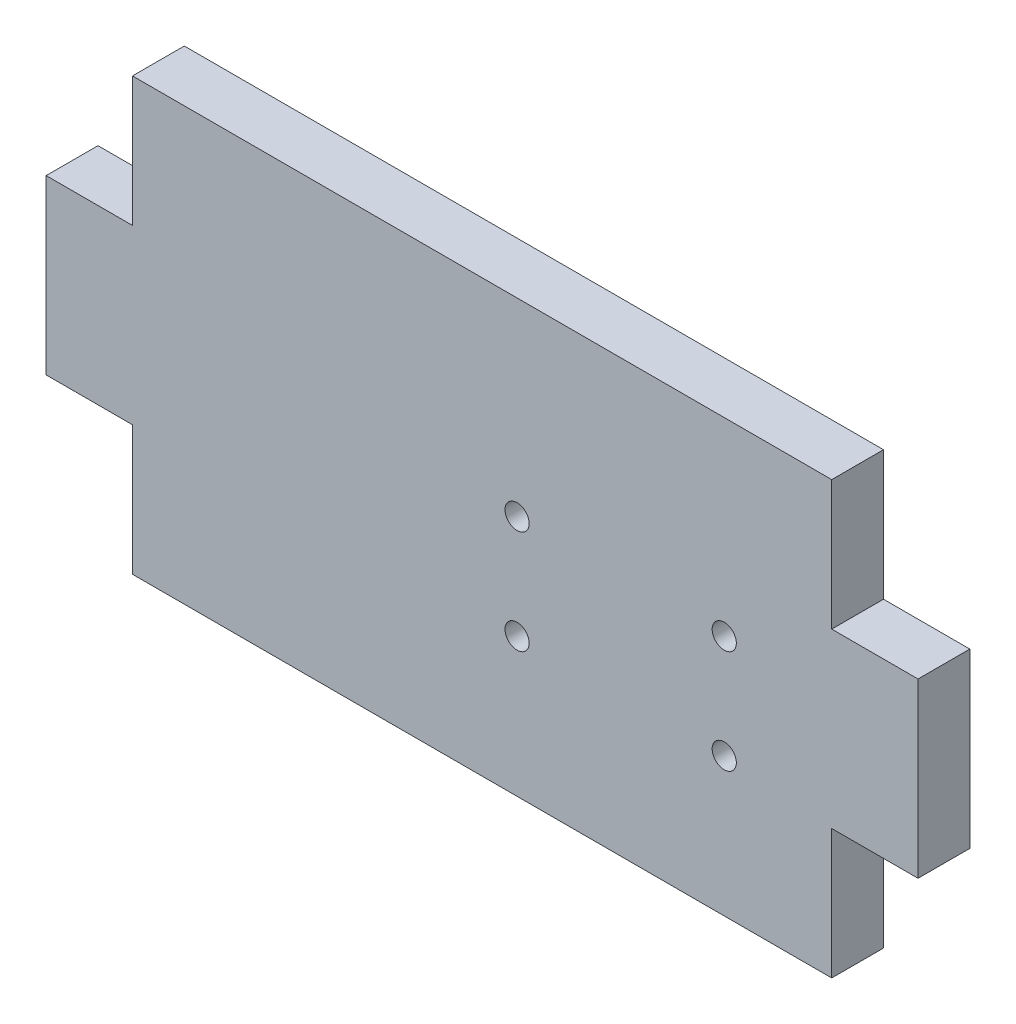
ISO-10303-21;
HEADER;
FILE_DESCRIPTION(('STEP AP214'),'2;1');
FILE_NAME('part.step','',(''),(''),'','','');
FILE_SCHEMA(('AUTOMOTIVE_DESIGN { 1 0 10303 214 1 1 1 1 }'));
ENDSEC;
DATA;
#1=APPLICATION_CONTEXT('core data for automotive mechanical design processes');
#2=APPLICATION_PROTOCOL_DEFINITION('international standard','automotive_design',2000,#1);
#3=PRODUCT_CONTEXT('',#1,'mechanical');
#4=PRODUCT('Part','Part','',(#3));
#5=PRODUCT_RELATED_PRODUCT_CATEGORY('part','',(#4));
#6=PRODUCT_DEFINITION_FORMATION('','',#4);
#7=PRODUCT_DEFINITION_CONTEXT('part definition',#1,'design');
#8=PRODUCT_DEFINITION('design','',#6,#7);
#9=PRODUCT_DEFINITION_SHAPE('','',#8);
#10=(LENGTH_UNIT() NAMED_UNIT(*) SI_UNIT(.MILLI.,.METRE.));
#11=(NAMED_UNIT(*) PLANE_ANGLE_UNIT() SI_UNIT($,.RADIAN.));
#12=(NAMED_UNIT(*) SI_UNIT($,.STERADIAN.) SOLID_ANGLE_UNIT());
#13=UNCERTAINTY_MEASURE_WITH_UNIT(LENGTH_MEASURE(1.E-05),#10,'distance_accuracy_value','');
#14=(GEOMETRIC_REPRESENTATION_CONTEXT(3) GLOBAL_UNCERTAINTY_ASSIGNED_CONTEXT((#13)) GLOBAL_UNIT_ASSIGNED_CONTEXT((#10,
#11,#12)) REPRESENTATION_CONTEXT('',''));
#15=CARTESIAN_POINT('',(0.,0.,0.));
#16=DIRECTION('',(0.,0.,1.));
#17=DIRECTION('',(1.,0.,0.));
#18=AXIS2_PLACEMENT_3D('',#15,#16,#17);
#19=CARTESIAN_POINT('',(44.550340057059,16.0653133446784,9.95979797464467));
#20=DIRECTION('',(0.,0.,-1.));
#21=DIRECTION('',(-1.,0.,0.));
#22=AXIS2_PLACEMENT_3D('',#19,#20,#21);
#23=CYLINDRICAL_SURFACE('',#22,1.4);
#24=CARTESIAN_POINT('',(44.550340057059,16.0653133446784,6.));
#25=DIRECTION('',(0.,0.,1.));
#26=DIRECTION('',(1.,0.,0.));
#27=AXIS2_PLACEMENT_3D('',#24,#25,#26);
#28=CIRCLE('',#27,1.4);
#29=CARTESIAN_POINT('',(45.950340057059,16.0653133446784,6.));
#30=VERTEX_POINT('',#29);
#31=EDGE_CURVE('E167',#30,#30,#28,.F.);
#32=ORIENTED_EDGE('',*,*,#31,.F.);
#33=EDGE_LOOP('',(#32));
#34=FACE_BOUND('',#33,.T.);
#35=CARTESIAN_POINT('',(44.550340057059,16.0653133446784,4.));
#36=DIRECTION('',(0.,0.,-1.));
#37=DIRECTION('',(-1.,0.,0.));
#38=AXIS2_PLACEMENT_3D('',#35,#36,#37);
#39=CIRCLE('',#38,1.4);
#40=CARTESIAN_POINT('',(43.150340057059,16.0653133446784,4.));
#41=VERTEX_POINT('',#40);
#42=EDGE_CURVE('E41',#41,#41,#39,.F.);
#43=ORIENTED_EDGE('',*,*,#42,.F.);
#44=EDGE_LOOP('',(#43));
#45=FACE_BOUND('',#44,.T.);
#46=ADVANCED_FACE('F37',(#34,#45),#23,.F.);
#47=CARTESIAN_POINT('',(44.550340057059,28.0653133446784,9.95979797464467));
#48=DIRECTION('',(0.,0.,-1.));
#49=DIRECTION('',(-1.,0.,0.));
#50=AXIS2_PLACEMENT_3D('',#47,#48,#49);
#51=CYLINDRICAL_SURFACE('',#50,1.4);
#52=CARTESIAN_POINT('',(44.550340057059,28.0653133446784,6.));
#53=DIRECTION('',(0.,0.,1.));
#54=DIRECTION('',(1.,0.,0.));
#55=AXIS2_PLACEMENT_3D('',#52,#53,#54);
#56=CIRCLE('',#55,1.4);
#57=CARTESIAN_POINT('',(45.950340057059,28.0653133446784,6.));
#58=VERTEX_POINT('',#57);
#59=EDGE_CURVE('E230',#58,#58,#56,.F.);
#60=ORIENTED_EDGE('',*,*,#59,.F.);
#61=EDGE_LOOP('',(#60));
#62=FACE_BOUND('',#61,.T.);
#63=CARTESIAN_POINT('',(44.550340057059,28.0653133446784,4.));
#64=DIRECTION('',(0.,0.,-1.));
#65=DIRECTION('',(-1.,0.,0.));
#66=AXIS2_PLACEMENT_3D('',#63,#64,#65);
#67=CIRCLE('',#66,1.4);
#68=CARTESIAN_POINT('',(43.150340057059,28.0653133446784,4.));
#69=VERTEX_POINT('',#68);
#70=EDGE_CURVE('E216',#69,#69,#67,.F.);
#71=ORIENTED_EDGE('',*,*,#70,.F.);
#72=EDGE_LOOP('',(#71));
#73=FACE_BOUND('',#72,.T.);
#74=ADVANCED_FACE('F272',(#62,#73),#51,.F.);
#75=CARTESIAN_POINT('',(68.550340057059,28.0653133446784,9.95979797464467));
#76=DIRECTION('',(0.,0.,-1.));
#77=DIRECTION('',(-1.,0.,0.));
#78=AXIS2_PLACEMENT_3D('',#75,#76,#77);
#79=CYLINDRICAL_SURFACE('',#78,1.4);
#80=CARTESIAN_POINT('',(68.550340057059,28.0653133446784,6.));
#81=DIRECTION('',(0.,0.,1.));
#82=DIRECTION('',(1.,0.,0.));
#83=AXIS2_PLACEMENT_3D('',#80,#81,#82);
#84=CIRCLE('',#83,1.4);
#85=CARTESIAN_POINT('',(69.950340057059,28.0653133446784,6.));
#86=VERTEX_POINT('',#85);
#87=EDGE_CURVE('E225',#86,#86,#84,.F.);
#88=ORIENTED_EDGE('',*,*,#87,.F.);
#89=EDGE_LOOP('',(#88));
#90=FACE_BOUND('',#89,.T.);
#91=CARTESIAN_POINT('',(68.550340057059,28.0653133446784,4.));
#92=DIRECTION('',(0.,0.,-1.));
#93=DIRECTION('',(-1.,0.,0.));
#94=AXIS2_PLACEMENT_3D('',#91,#92,#93);
#95=CIRCLE('',#94,1.4);
#96=CARTESIAN_POINT('',(67.150340057059,28.0653133446784,4.));
#97=VERTEX_POINT('',#96);
#98=EDGE_CURVE('E213',#97,#97,#95,.F.);
#99=ORIENTED_EDGE('',*,*,#98,.F.);
#100=EDGE_LOOP('',(#99));
#101=FACE_BOUND('',#100,.T.);
#102=ADVANCED_FACE('F278',(#90,#101),#79,.F.);
#103=CARTESIAN_POINT('',(68.550340057059,16.0653133446784,9.95979797464467));
#104=DIRECTION('',(0.,0.,-1.));
#105=DIRECTION('',(-1.,0.,0.));
#106=AXIS2_PLACEMENT_3D('',#103,#104,#105);
#107=CYLINDRICAL_SURFACE('',#106,1.4);
#108=CARTESIAN_POINT('',(68.550340057059,16.0653133446784,6.));
#109=DIRECTION('',(0.,0.,1.));
#110=DIRECTION('',(1.,0.,0.));
#111=AXIS2_PLACEMENT_3D('',#108,#109,#110);
#112=CIRCLE('',#111,1.4);
#113=CARTESIAN_POINT('',(69.950340057059,16.0653133446784,6.));
#114=VERTEX_POINT('',#113);
#115=EDGE_CURVE('E221',#114,#114,#112,.F.);
#116=ORIENTED_EDGE('',*,*,#115,.F.);
#117=EDGE_LOOP('',(#116));
#118=FACE_BOUND('',#117,.T.);
#119=CARTESIAN_POINT('',(68.550340057059,16.0653133446784,4.));
#120=DIRECTION('',(0.,0.,-1.));
#121=DIRECTION('',(-1.,0.,0.));
#122=AXIS2_PLACEMENT_3D('',#119,#120,#121);
#123=CIRCLE('',#122,1.4);
#124=CARTESIAN_POINT('',(67.150340057059,16.0653133446784,4.));
#125=VERTEX_POINT('',#124);
#126=EDGE_CURVE('E210',#125,#125,#123,.F.);
#127=ORIENTED_EDGE('',*,*,#126,.F.);
#128=EDGE_LOOP('',(#127));
#129=FACE_BOUND('',#128,.T.);
#130=ADVANCED_FACE('F284',(#118,#129),#107,.F.);
#131=CARTESIAN_POINT('',(0.,35.,6.));
#132=DIRECTION('',(0.,-1.,0.));
#133=DIRECTION('',(0.,0.,-1.));
#134=AXIS2_PLACEMENT_3D('',#131,#132,#133);
#135=PLANE('',#134);
#136=DIRECTION('',(-1.,0.,0.));
#137=VECTOR('',#136,1.);
#138=CARTESIAN_POINT('',(0.,35.,0.));
#139=LINE('',#138,#137);
#140=CARTESIAN_POINT('',(0.,35.,0.));
#141=VERTEX_POINT('',#140);
#142=CARTESIAN_POINT('',(-10.,35.,0.));
#143=VERTEX_POINT('',#142);
#144=EDGE_CURVE('E164',#141,#143,#139,.T.);
#145=ORIENTED_EDGE('',*,*,#144,.T.);
#146=DIRECTION('',(0.,0.,-1.));
#147=VECTOR('',#146,1.);
#148=CARTESIAN_POINT('',(-10.,35.,6.));
#149=LINE('',#148,#147);
#150=CARTESIAN_POINT('',(-10.,35.,6.));
#151=VERTEX_POINT('',#150);
#152=EDGE_CURVE('E11',#151,#143,#149,.T.);
#153=ORIENTED_EDGE('',*,*,#152,.F.);
#154=DIRECTION('',(-1.,0.,0.));
#155=VECTOR('',#154,1.);
#156=CARTESIAN_POINT('',(0.,35.,6.));
#157=LINE('',#156,#155);
#158=CARTESIAN_POINT('',(0.,35.,6.));
#159=VERTEX_POINT('',#158);
#160=EDGE_CURVE('E236',#159,#151,#157,.T.);
#161=ORIENTED_EDGE('',*,*,#160,.F.);
#162=DIRECTION('',(0.,0.,-1.));
#163=VECTOR('',#162,1.);
#164=CARTESIAN_POINT('',(0.,35.,6.));
#165=LINE('',#164,#163);
#166=EDGE_CURVE('E56',#159,#141,#165,.T.);
#167=ORIENTED_EDGE('',*,*,#166,.T.);
#168=EDGE_LOOP('',(#145,#153,#161,#167));
#169=FACE_BOUND('',#168,.T.);
#170=ADVANCED_FACE('F39',(#169),#135,.F.);
#171=CARTESIAN_POINT('',(-10.,0.,6.));
#172=DIRECTION('',(1.,0.,0.));
#173=DIRECTION('',(0.,1.,0.));
#174=AXIS2_PLACEMENT_3D('',#171,#172,#173);
#175=PLANE('',#174);
#176=DIRECTION('',(0.,-1.,0.));
#177=VECTOR('',#176,1.);
#178=CARTESIAN_POINT('',(-10.,0.,0.));
#179=LINE('',#178,#177);
#180=CARTESIAN_POINT('',(-10.,15.,0.));
#181=VERTEX_POINT('',#180);
#182=EDGE_CURVE('E166',#143,#181,#179,.T.);
#183=ORIENTED_EDGE('',*,*,#182,.T.);
#184=DIRECTION('',(0.,0.,-1.));
#185=VECTOR('',#184,1.);
#186=CARTESIAN_POINT('',(-10.,15.,6.));
#187=LINE('',#186,#185);
#188=CARTESIAN_POINT('',(-10.,15.,6.));
#189=VERTEX_POINT('',#188);
#190=EDGE_CURVE('E47',#189,#181,#187,.T.);
#191=ORIENTED_EDGE('',*,*,#190,.F.);
#192=DIRECTION('',(0.,-1.,0.));
#193=VECTOR('',#192,1.);
#194=CARTESIAN_POINT('',(-10.,0.,6.));
#195=LINE('',#194,#193);
#196=EDGE_CURVE('E106',#151,#189,#195,.T.);
#197=ORIENTED_EDGE('',*,*,#196,.F.);
#198=ORIENTED_EDGE('',*,*,#152,.T.);
#199=EDGE_LOOP('',(#183,#191,#197,#198));
#200=FACE_BOUND('',#199,.T.);
#201=ADVANCED_FACE('F376',(#200),#175,.F.);
#202=CARTESIAN_POINT('',(0.,15.,6.));
#203=DIRECTION('',(0.,-1.,0.));
#204=DIRECTION('',(0.,0.,-1.));
#205=AXIS2_PLACEMENT_3D('',#202,#203,#204);
#206=PLANE('',#205);
#207=DIRECTION('',(-1.,0.,0.));
#208=VECTOR('',#207,1.);
#209=CARTESIAN_POINT('',(0.,15.,0.));
#210=LINE('',#209,#208);
#211=CARTESIAN_POINT('',(0.,15.,0.));
#212=VERTEX_POINT('',#211);
#213=EDGE_CURVE('E170',#212,#181,#210,.T.);
#214=ORIENTED_EDGE('',*,*,#213,.F.);
#215=DIRECTION('',(0.,0.,-1.));
#216=VECTOR('',#215,1.);
#217=CARTESIAN_POINT('',(0.,15.,6.));
#218=LINE('',#217,#216);
#219=CARTESIAN_POINT('',(0.,15.,6.));
#220=VERTEX_POINT('',#219);
#221=EDGE_CURVE('E207',#220,#212,#218,.T.);
#222=ORIENTED_EDGE('',*,*,#221,.F.);
#223=DIRECTION('',(-1.,0.,0.));
#224=VECTOR('',#223,1.);
#225=CARTESIAN_POINT('',(0.,15.,6.));
#226=LINE('',#225,#224);
#227=EDGE_CURVE('E239',#220,#189,#226,.T.);
#228=ORIENTED_EDGE('',*,*,#227,.T.);
#229=ORIENTED_EDGE('',*,*,#190,.T.);
#230=EDGE_LOOP('',(#214,#222,#228,#229));
#231=FACE_BOUND('',#230,.T.);
#232=ADVANCED_FACE('F269',(#231),#206,.T.);
#233=CARTESIAN_POINT('',(0.,0.,6.));
#234=DIRECTION('',(-1.,0.,0.));
#235=DIRECTION('',(0.,0.,1.));
#236=AXIS2_PLACEMENT_3D('',#233,#234,#235);
#237=PLANE('',#236);
#238=DIRECTION('',(0.,1.,0.));
#239=VECTOR('',#238,1.);
#240=CARTESIAN_POINT('',(0.,0.,0.));
#241=LINE('',#240,#239);
#242=CARTESIAN_POINT('',(0.,0.,0.));
#243=VERTEX_POINT('',#242);
#244=EDGE_CURVE('E173',#243,#212,#241,.T.);
#245=ORIENTED_EDGE('',*,*,#244,.F.);
#246=DIRECTION('',(0.,0.,-1.));
#247=VECTOR('',#246,1.);
#248=CARTESIAN_POINT('',(0.,0.,6.));
#249=LINE('',#248,#247);
#250=CARTESIAN_POINT('',(0.,0.,6.));
#251=VERTEX_POINT('',#250);
#252=EDGE_CURVE('E205',#251,#243,#249,.T.);
#253=ORIENTED_EDGE('',*,*,#252,.F.);
#254=DIRECTION('',(0.,1.,0.));
#255=VECTOR('',#254,1.);
#256=CARTESIAN_POINT('',(0.,0.,6.));
#257=LINE('',#256,#255);
#258=EDGE_CURVE('E160',#251,#220,#257,.T.);
#259=ORIENTED_EDGE('',*,*,#258,.T.);
#260=ORIENTED_EDGE('',*,*,#221,.T.);
#261=EDGE_LOOP('',(#245,#253,#259,#260));
#262=FACE_BOUND('',#261,.T.);
#263=ADVANCED_FACE('F259',(#262),#237,.T.);
#264=CARTESIAN_POINT('',(0.,0.,6.));
#265=DIRECTION('',(0.,1.,0.));
#266=DIRECTION('',(0.,0.,1.));
#267=AXIS2_PLACEMENT_3D('',#264,#265,#266);
#268=PLANE('',#267);
#269=DIRECTION('',(1.,0.,0.));
#270=VECTOR('',#269,1.);
#271=CARTESIAN_POINT('',(0.,0.,0.));
#272=LINE('',#271,#270);
#273=CARTESIAN_POINT('',(81.,0.,0.));
#274=VERTEX_POINT('',#273);
#275=EDGE_CURVE('E176',#243,#274,#272,.T.);
#276=ORIENTED_EDGE('',*,*,#275,.T.);
#277=DIRECTION('',(0.,0.,-1.));
#278=VECTOR('',#277,1.);
#279=CARTESIAN_POINT('',(81.,0.,6.));
#280=LINE('',#279,#278);
#281=CARTESIAN_POINT('',(81.,0.,6.));
#282=VERTEX_POINT('',#281);
#283=EDGE_CURVE('E202',#282,#274,#280,.T.);
#284=ORIENTED_EDGE('',*,*,#283,.F.);
#285=DIRECTION('',(1.,0.,0.));
#286=VECTOR('',#285,1.);
#287=CARTESIAN_POINT('',(0.,0.,6.));
#288=LINE('',#287,#286);
#289=EDGE_CURVE('E243',#251,#282,#288,.T.);
#290=ORIENTED_EDGE('',*,*,#289,.F.);
#291=ORIENTED_EDGE('',*,*,#252,.T.);
#292=EDGE_LOOP('',(#276,#284,#290,#291));
#293=FACE_BOUND('',#292,.T.);
#294=ADVANCED_FACE('F268',(#293),#268,.F.);
#295=CARTESIAN_POINT('',(81.,0.,6.));
#296=DIRECTION('',(-1.,0.,0.));
#297=DIRECTION('',(0.,0.,1.));
#298=AXIS2_PLACEMENT_3D('',#295,#296,#297);
#299=PLANE('',#298);
#300=DIRECTION('',(0.,1.,0.));
#301=VECTOR('',#300,1.);
#302=CARTESIAN_POINT('',(81.,0.,0.));
#303=LINE('',#302,#301);
#304=CARTESIAN_POINT('',(81.,15.,0.));
#305=VERTEX_POINT('',#304);
#306=EDGE_CURVE('E179',#274,#305,#303,.T.);
#307=ORIENTED_EDGE('',*,*,#306,.T.);
#308=DIRECTION('',(0.,0.,-1.));
#309=VECTOR('',#308,1.);
#310=CARTESIAN_POINT('',(81.,15.,6.));
#311=LINE('',#310,#309);
#312=CARTESIAN_POINT('',(81.,15.,6.));
#313=VERTEX_POINT('',#312);
#314=EDGE_CURVE('E199',#313,#305,#311,.T.);
#315=ORIENTED_EDGE('',*,*,#314,.F.);
#316=DIRECTION('',(0.,1.,0.));
#317=VECTOR('',#316,1.);
#318=CARTESIAN_POINT('',(81.,0.,6.));
#319=LINE('',#318,#317);
#320=EDGE_CURVE('E146',#282,#313,#319,.T.);
#321=ORIENTED_EDGE('',*,*,#320,.F.);
#322=ORIENTED_EDGE('',*,*,#283,.T.);
#323=EDGE_LOOP('',(#307,#315,#321,#322));
#324=FACE_BOUND('',#323,.T.);
#325=ADVANCED_FACE('F398',(#324),#299,.F.);
#326=CARTESIAN_POINT('',(0.,15.,6.));
#327=DIRECTION('',(0.,1.,0.));
#328=DIRECTION('',(0.,0.,1.));
#329=AXIS2_PLACEMENT_3D('',#326,#327,#328);
#330=PLANE('',#329);
#331=DIRECTION('',(1.,0.,0.));
#332=VECTOR('',#331,1.);
#333=CARTESIAN_POINT('',(0.,15.,0.));
#334=LINE('',#333,#332);
#335=CARTESIAN_POINT('',(91.,15.,0.));
#336=VERTEX_POINT('',#335);
#337=EDGE_CURVE('E181',#305,#336,#334,.T.);
#338=ORIENTED_EDGE('',*,*,#337,.T.);
#339=DIRECTION('',(0.,0.,-1.));
#340=VECTOR('',#339,1.);
#341=CARTESIAN_POINT('',(91.,15.,6.));
#342=LINE('',#341,#340);
#343=CARTESIAN_POINT('',(91.,15.,6.));
#344=VERTEX_POINT('',#343);
#345=EDGE_CURVE('E197',#344,#336,#342,.T.);
#346=ORIENTED_EDGE('',*,*,#345,.F.);
#347=DIRECTION('',(1.,0.,0.));
#348=VECTOR('',#347,1.);
#349=CARTESIAN_POINT('',(0.,15.,6.));
#350=LINE('',#349,#348);
#351=EDGE_CURVE('E245',#313,#344,#350,.T.);
#352=ORIENTED_EDGE('',*,*,#351,.F.);
#353=ORIENTED_EDGE('',*,*,#314,.T.);
#354=EDGE_LOOP('',(#338,#346,#352,#353));
#355=FACE_BOUND('',#354,.T.);
#356=ADVANCED_FACE('F402',(#355),#330,.F.);
#357=CARTESIAN_POINT('',(91.,0.,6.));
#358=DIRECTION('',(1.,0.,0.));
#359=DIRECTION('',(0.,0.,-1.));
#360=AXIS2_PLACEMENT_3D('',#357,#358,#359);
#361=PLANE('',#360);
#362=DIRECTION('',(0.,-1.,0.));
#363=VECTOR('',#362,1.);
#364=CARTESIAN_POINT('',(91.,0.,0.));
#365=LINE('',#364,#363);
#366=CARTESIAN_POINT('',(91.,35.,0.));
#367=VERTEX_POINT('',#366);
#368=EDGE_CURVE('E184',#367,#336,#365,.T.);
#369=ORIENTED_EDGE('',*,*,#368,.F.);
#370=DIRECTION('',(0.,0.,-1.));
#371=VECTOR('',#370,1.);
#372=CARTESIAN_POINT('',(91.,35.,6.));
#373=LINE('',#372,#371);
#374=CARTESIAN_POINT('',(91.,35.,6.));
#375=VERTEX_POINT('',#374);
#376=EDGE_CURVE('E195',#375,#367,#373,.T.);
#377=ORIENTED_EDGE('',*,*,#376,.F.);
#378=DIRECTION('',(0.,-1.,0.));
#379=VECTOR('',#378,1.);
#380=CARTESIAN_POINT('',(91.,0.,6.));
#381=LINE('',#380,#379);
#382=EDGE_CURVE('E246',#375,#344,#381,.T.);
#383=ORIENTED_EDGE('',*,*,#382,.T.);
#384=ORIENTED_EDGE('',*,*,#345,.T.);
#385=EDGE_LOOP('',(#369,#377,#383,#384));
#386=FACE_BOUND('',#385,.T.);
#387=ADVANCED_FACE('F403',(#386),#361,.T.);
#388=CARTESIAN_POINT('',(0.,35.,6.));
#389=DIRECTION('',(0.,1.,0.));
#390=DIRECTION('',(0.,0.,1.));
#391=AXIS2_PLACEMENT_3D('',#388,#389,#390);
#392=PLANE('',#391);
#393=DIRECTION('',(1.,0.,0.));
#394=VECTOR('',#393,1.);
#395=CARTESIAN_POINT('',(0.,35.,0.));
#396=LINE('',#395,#394);
#397=CARTESIAN_POINT('',(81.,35.,0.));
#398=VERTEX_POINT('',#397);
#399=EDGE_CURVE('E187',#398,#367,#396,.T.);
#400=ORIENTED_EDGE('',*,*,#399,.F.);
#401=DIRECTION('',(0.,0.,-1.));
#402=VECTOR('',#401,1.);
#403=CARTESIAN_POINT('',(81.,35.,6.));
#404=LINE('',#403,#402);
#405=CARTESIAN_POINT('',(81.,35.,6.));
#406=VERTEX_POINT('',#405);
#407=EDGE_CURVE('E154',#406,#398,#404,.T.);
#408=ORIENTED_EDGE('',*,*,#407,.F.);
#409=DIRECTION('',(1.,0.,0.));
#410=VECTOR('',#409,1.);
#411=CARTESIAN_POINT('',(0.,35.,6.));
#412=LINE('',#411,#410);
#413=EDGE_CURVE('E143',#406,#375,#412,.T.);
#414=ORIENTED_EDGE('',*,*,#413,.T.);
#415=ORIENTED_EDGE('',*,*,#376,.T.);
#416=EDGE_LOOP('',(#400,#408,#414,#415));
#417=FACE_BOUND('',#416,.T.);
#418=ADVANCED_FACE('F251',(#417),#392,.T.);
#419=CARTESIAN_POINT('',(81.,50.,0.));
#420=VERTEX_POINT('',#419);
#421=EDGE_CURVE('E151',#398,#420,#303,.T.);
#422=ORIENTED_EDGE('',*,*,#421,.T.);
#423=DIRECTION('',(0.,0.,-1.));
#424=VECTOR('',#423,1.);
#425=CARTESIAN_POINT('',(81.,50.,6.));
#426=LINE('',#425,#424);
#427=CARTESIAN_POINT('',(81.,50.,6.));
#428=VERTEX_POINT('',#427);
#429=EDGE_CURVE('E148',#428,#420,#426,.T.);
#430=ORIENTED_EDGE('',*,*,#429,.F.);
#431=EDGE_CURVE('E135',#406,#428,#319,.T.);
#432=ORIENTED_EDGE('',*,*,#431,.F.);
#433=ORIENTED_EDGE('',*,*,#407,.T.);
#434=EDGE_LOOP('',(#422,#430,#432,#433));
#435=FACE_BOUND('',#434,.T.);
#436=ADVANCED_FACE('F149',(#435),#299,.F.);
#437=CARTESIAN_POINT('',(0.,50.,6.));
#438=DIRECTION('',(0.,1.,0.));
#439=DIRECTION('',(0.,0.,1.));
#440=AXIS2_PLACEMENT_3D('',#437,#438,#439);
#441=PLANE('',#440);
#442=DIRECTION('',(1.,0.,0.));
#443=VECTOR('',#442,1.);
#444=CARTESIAN_POINT('',(0.,50.,0.));
#445=LINE('',#444,#443);
#446=CARTESIAN_POINT('',(0.,50.,0.));
#447=VERTEX_POINT('',#446);
#448=EDGE_CURVE('E190',#447,#420,#445,.T.);
#449=ORIENTED_EDGE('',*,*,#448,.F.);
#450=DIRECTION('',(0.,0.,-1.));
#451=VECTOR('',#450,1.);
#452=CARTESIAN_POINT('',(0.,50.,6.));
#453=LINE('',#452,#451);
#454=CARTESIAN_POINT('',(0.,50.,6.));
#455=VERTEX_POINT('',#454);
#456=EDGE_CURVE('E94',#455,#447,#453,.T.);
#457=ORIENTED_EDGE('',*,*,#456,.F.);
#458=DIRECTION('',(1.,0.,0.));
#459=VECTOR('',#458,1.);
#460=CARTESIAN_POINT('',(0.,50.,6.));
#461=LINE('',#460,#459);
#462=EDGE_CURVE('E140',#455,#428,#461,.T.);
#463=ORIENTED_EDGE('',*,*,#462,.T.);
#464=ORIENTED_EDGE('',*,*,#429,.T.);
#465=EDGE_LOOP('',(#449,#457,#463,#464));
#466=FACE_BOUND('',#465,.T.);
#467=ADVANCED_FACE('F156',(#466),#441,.T.);
#468=EDGE_CURVE('E177',#141,#447,#241,.T.);
#469=ORIENTED_EDGE('',*,*,#468,.F.);
#470=ORIENTED_EDGE('',*,*,#166,.F.);
#471=EDGE_CURVE('E157',#159,#455,#257,.T.);
#472=ORIENTED_EDGE('',*,*,#471,.T.);
#473=ORIENTED_EDGE('',*,*,#456,.T.);
#474=EDGE_LOOP('',(#469,#470,#472,#473));
#475=FACE_BOUND('',#474,.T.);
#476=ADVANCED_FACE('F256',(#475),#237,.T.);
#477=CARTESIAN_POINT('',(0.,0.,6.));
#478=DIRECTION('',(0.,0.,1.));
#479=DIRECTION('',(1.,0.,0.));
#480=AXIS2_PLACEMENT_3D('',#477,#478,#479);
#481=PLANE('',#480);
#482=ORIENTED_EDGE('',*,*,#115,.T.);
#483=EDGE_LOOP('',(#482));
#484=FACE_BOUND('',#483,.T.);
#485=ORIENTED_EDGE('',*,*,#87,.T.);
#486=EDGE_LOOP('',(#485));
#487=FACE_BOUND('',#486,.T.);
#488=ORIENTED_EDGE('',*,*,#59,.T.);
#489=EDGE_LOOP('',(#488));
#490=FACE_BOUND('',#489,.T.);
#491=ORIENTED_EDGE('',*,*,#31,.T.);
#492=EDGE_LOOP('',(#491));
#493=FACE_BOUND('',#492,.T.);
#494=ORIENTED_EDGE('',*,*,#160,.T.);
#495=ORIENTED_EDGE('',*,*,#196,.T.);
#496=ORIENTED_EDGE('',*,*,#227,.F.);
#497=ORIENTED_EDGE('',*,*,#258,.F.);
#498=ORIENTED_EDGE('',*,*,#289,.T.);
#499=ORIENTED_EDGE('',*,*,#320,.T.);
#500=ORIENTED_EDGE('',*,*,#351,.T.);
#501=ORIENTED_EDGE('',*,*,#382,.F.);
#502=ORIENTED_EDGE('',*,*,#413,.F.);
#503=ORIENTED_EDGE('',*,*,#431,.T.);
#504=ORIENTED_EDGE('',*,*,#462,.F.);
#505=ORIENTED_EDGE('',*,*,#471,.F.);
#506=EDGE_LOOP('',(#494,#495,#496,#497,#498,#499,#500,#501,#502,#503,#504,#505));
#507=FACE_BOUND('',#506,.T.);
#508=ADVANCED_FACE('F137',(#484,#487,#490,#493,#507),#481,.T.);
#509=CARTESIAN_POINT('',(0.,0.,0.));
#510=DIRECTION('',(0.,0.,1.));
#511=DIRECTION('',(1.,0.,0.));
#512=AXIS2_PLACEMENT_3D('',#509,#510,#511);
#513=PLANE('',#512);
#514=CARTESIAN_POINT('',(68.550340057059,16.0653133446784,0.));
#515=DIRECTION('',(0.,0.,-1.));
#516=DIRECTION('',(-1.,0.,0.));
#517=AXIS2_PLACEMENT_3D('',#514,#515,#516);
#518=CIRCLE('',#517,3.00000000000001);
#519=CARTESIAN_POINT('',(65.550340057059,16.0653133446784,0.));
#520=VERTEX_POINT('',#519);
#521=EDGE_CURVE('E298',#520,#520,#518,.T.);
#522=ORIENTED_EDGE('',*,*,#521,.F.);
#523=EDGE_LOOP('',(#522));
#524=FACE_BOUND('',#523,.T.);
#525=CARTESIAN_POINT('',(44.550340057059,16.0653133446784,0.));
#526=DIRECTION('',(0.,0.,-1.));
#527=DIRECTION('',(-1.,0.,0.));
#528=AXIS2_PLACEMENT_3D('',#525,#526,#527);
#529=CIRCLE('',#528,3.);
#530=CARTESIAN_POINT('',(41.550340057059,16.0653133446784,0.));
#531=VERTEX_POINT('',#530);
#532=EDGE_CURVE('E302',#531,#531,#529,.T.);
#533=ORIENTED_EDGE('',*,*,#532,.F.);
#534=EDGE_LOOP('',(#533));
#535=FACE_BOUND('',#534,.T.);
#536=CARTESIAN_POINT('',(44.550340057059,28.0653133446784,0.));
#537=DIRECTION('',(0.,0.,-1.));
#538=DIRECTION('',(-1.,0.,0.));
#539=AXIS2_PLACEMENT_3D('',#536,#537,#538);
#540=CIRCLE('',#539,3.);
#541=CARTESIAN_POINT('',(41.550340057059,28.0653133446784,0.));
#542=VERTEX_POINT('',#541);
#543=EDGE_CURVE('E306',#542,#542,#540,.T.);
#544=ORIENTED_EDGE('',*,*,#543,.F.);
#545=EDGE_LOOP('',(#544));
#546=FACE_BOUND('',#545,.T.);
#547=CARTESIAN_POINT('',(68.550340057059,28.0653133446784,0.));
#548=DIRECTION('',(0.,0.,-1.));
#549=DIRECTION('',(-1.,0.,0.));
#550=AXIS2_PLACEMENT_3D('',#547,#548,#549);
#551=CIRCLE('',#550,3.00000000000001);
#552=CARTESIAN_POINT('',(65.550340057059,28.0653133446784,0.));
#553=VERTEX_POINT('',#552);
#554=EDGE_CURVE('E309',#553,#553,#551,.T.);
#555=ORIENTED_EDGE('',*,*,#554,.F.);
#556=EDGE_LOOP('',(#555));
#557=FACE_BOUND('',#556,.T.);
#558=ORIENTED_EDGE('',*,*,#144,.F.);
#559=ORIENTED_EDGE('',*,*,#468,.T.);
#560=ORIENTED_EDGE('',*,*,#448,.T.);
#561=ORIENTED_EDGE('',*,*,#421,.F.);
#562=ORIENTED_EDGE('',*,*,#399,.T.);
#563=ORIENTED_EDGE('',*,*,#368,.T.);
#564=ORIENTED_EDGE('',*,*,#337,.F.);
#565=ORIENTED_EDGE('',*,*,#306,.F.);
#566=ORIENTED_EDGE('',*,*,#275,.F.);
#567=ORIENTED_EDGE('',*,*,#244,.T.);
#568=ORIENTED_EDGE('',*,*,#213,.T.);
#569=ORIENTED_EDGE('',*,*,#182,.F.);
#570=EDGE_LOOP('',(#558,#559,#560,#561,#562,#563,#564,#565,#566,#567,#568,#569));
#571=FACE_BOUND('',#570,.T.);
#572=ADVANCED_FACE('F254',(#524,#535,#546,#557,#571),#513,.F.);
#573=CARTESIAN_POINT('',(68.550340057059,16.0653133446784,4.));
#574=DIRECTION('',(0.,0.,-1.));
#575=DIRECTION('',(-1.,0.,0.));
#576=AXIS2_PLACEMENT_3D('',#573,#574,#575);
#577=PLANE('',#576);
#578=CARTESIAN_POINT('',(68.550340057059,16.0653133446784,4.));
#579=DIRECTION('',(0.,0.,-1.));
#580=DIRECTION('',(-1.,0.,0.));
#581=AXIS2_PLACEMENT_3D('',#578,#579,#580);
#582=CIRCLE('',#581,3.00000000000001);
#583=CARTESIAN_POINT('',(65.550340057059,16.0653133446784,4.));
#584=VERTEX_POINT('',#583);
#585=EDGE_CURVE('E324',#584,#584,#582,.T.);
#586=ORIENTED_EDGE('',*,*,#585,.T.);
#587=EDGE_LOOP('',(#586));
#588=FACE_BOUND('',#587,.T.);
#589=ORIENTED_EDGE('',*,*,#126,.T.);
#590=EDGE_LOOP('',(#589));
#591=FACE_BOUND('',#590,.T.);
#592=ADVANCED_FACE('F287',(#588,#591),#577,.T.);
#593=CARTESIAN_POINT('',(68.550340057059,16.0653133446784,4.));
#594=DIRECTION('',(0.,0.,-1.));
#595=DIRECTION('',(-1.,0.,0.));
#596=AXIS2_PLACEMENT_3D('',#593,#594,#595);
#597=CYLINDRICAL_SURFACE('',#596,3.00000000000001);
#598=ORIENTED_EDGE('',*,*,#585,.F.);
#599=EDGE_LOOP('',(#598));
#600=FACE_BOUND('',#599,.T.);
#601=ORIENTED_EDGE('',*,*,#521,.T.);
#602=EDGE_LOOP('',(#601));
#603=FACE_BOUND('',#602,.T.);
#604=ADVANCED_FACE('F292',(#600,#603),#597,.F.);
#605=CARTESIAN_POINT('',(68.550340057059,28.0653133446784,4.));
#606=DIRECTION('',(0.,0.,-1.));
#607=DIRECTION('',(-1.,0.,0.));
#608=AXIS2_PLACEMENT_3D('',#605,#606,#607);
#609=PLANE('',#608);
#610=CARTESIAN_POINT('',(68.550340057059,28.0653133446784,4.));
#611=DIRECTION('',(0.,0.,-1.));
#612=DIRECTION('',(-1.,0.,0.));
#613=AXIS2_PLACEMENT_3D('',#610,#611,#612);
#614=CIRCLE('',#613,3.00000000000001);
#615=CARTESIAN_POINT('',(65.550340057059,28.0653133446784,4.));
#616=VERTEX_POINT('',#615);
#617=EDGE_CURVE('E214',#616,#616,#614,.T.);
#618=ORIENTED_EDGE('',*,*,#617,.T.);
#619=EDGE_LOOP('',(#618));
#620=FACE_BOUND('',#619,.T.);
#621=ORIENTED_EDGE('',*,*,#98,.T.);
#622=EDGE_LOOP('',(#621));
#623=FACE_BOUND('',#622,.T.);
#624=ADVANCED_FACE('F355',(#620,#623),#609,.T.);
#625=CARTESIAN_POINT('',(68.550340057059,28.0653133446784,4.));
#626=DIRECTION('',(0.,0.,-1.));
#627=DIRECTION('',(-1.,0.,0.));
#628=AXIS2_PLACEMENT_3D('',#625,#626,#627);
#629=CYLINDRICAL_SURFACE('',#628,3.00000000000001);
#630=ORIENTED_EDGE('',*,*,#617,.F.);
#631=EDGE_LOOP('',(#630));
#632=FACE_BOUND('',#631,.T.);
#633=ORIENTED_EDGE('',*,*,#554,.T.);
#634=EDGE_LOOP('',(#633));
#635=FACE_BOUND('',#634,.T.);
#636=ADVANCED_FACE('F345',(#632,#635),#629,.F.);
#637=CARTESIAN_POINT('',(44.550340057059,28.0653133446784,4.));
#638=DIRECTION('',(0.,0.,-1.));
#639=DIRECTION('',(-1.,0.,0.));
#640=AXIS2_PLACEMENT_3D('',#637,#638,#639);
#641=PLANE('',#640);
#642=CARTESIAN_POINT('',(44.550340057059,28.0653133446784,4.));
#643=DIRECTION('',(0.,0.,-1.));
#644=DIRECTION('',(-1.,0.,0.));
#645=AXIS2_PLACEMENT_3D('',#642,#643,#644);
#646=CIRCLE('',#645,3.);
#647=CARTESIAN_POINT('',(41.550340057059,28.0653133446784,4.));
#648=VERTEX_POINT('',#647);
#649=EDGE_CURVE('E311',#648,#648,#646,.T.);
#650=ORIENTED_EDGE('',*,*,#649,.T.);
#651=EDGE_LOOP('',(#650));
#652=FACE_BOUND('',#651,.T.);
#653=ORIENTED_EDGE('',*,*,#70,.T.);
#654=EDGE_LOOP('',(#653));
#655=FACE_BOUND('',#654,.T.);
#656=ADVANCED_FACE('F335',(#652,#655),#641,.T.);
#657=CARTESIAN_POINT('',(44.550340057059,28.0653133446784,4.));
#658=DIRECTION('',(0.,0.,-1.));
#659=DIRECTION('',(-1.,0.,0.));
#660=AXIS2_PLACEMENT_3D('',#657,#658,#659);
#661=CYLINDRICAL_SURFACE('',#660,3.);
#662=ORIENTED_EDGE('',*,*,#649,.F.);
#663=EDGE_LOOP('',(#662));
#664=FACE_BOUND('',#663,.T.);
#665=ORIENTED_EDGE('',*,*,#543,.T.);
#666=EDGE_LOOP('',(#665));
#667=FACE_BOUND('',#666,.T.);
#668=ADVANCED_FACE('F332',(#664,#667),#661,.F.);
#669=CARTESIAN_POINT('',(44.550340057059,16.0653133446784,4.));
#670=DIRECTION('',(0.,0.,-1.));
#671=DIRECTION('',(-1.,0.,0.));
#672=AXIS2_PLACEMENT_3D('',#669,#670,#671);
#673=PLANE('',#672);
#674=CARTESIAN_POINT('',(44.550340057059,16.0653133446784,4.));
#675=DIRECTION('',(0.,0.,-1.));
#676=DIRECTION('',(-1.,0.,0.));
#677=AXIS2_PLACEMENT_3D('',#674,#675,#676);
#678=CIRCLE('',#677,3.);
#679=CARTESIAN_POINT('',(41.550340057059,16.0653133446784,4.));
#680=VERTEX_POINT('',#679);
#681=EDGE_CURVE('E328',#680,#680,#678,.T.);
#682=ORIENTED_EDGE('',*,*,#681,.T.);
#683=EDGE_LOOP('',(#682));
#684=FACE_BOUND('',#683,.T.);
#685=ORIENTED_EDGE('',*,*,#42,.T.);
#686=EDGE_LOOP('',(#685));
#687=FACE_BOUND('',#686,.T.);
#688=ADVANCED_FACE('F334',(#684,#687),#673,.T.);
#689=CARTESIAN_POINT('',(44.550340057059,16.0653133446784,4.));
#690=DIRECTION('',(0.,0.,-1.));
#691=DIRECTION('',(-1.,0.,0.));
#692=AXIS2_PLACEMENT_3D('',#689,#690,#691);
#693=CYLINDRICAL_SURFACE('',#692,3.);
#694=ORIENTED_EDGE('',*,*,#681,.F.);
#695=EDGE_LOOP('',(#694));
#696=FACE_BOUND('',#695,.T.);
#697=ORIENTED_EDGE('',*,*,#532,.T.);
#698=EDGE_LOOP('',(#697));
#699=FACE_BOUND('',#698,.T.);
#700=ADVANCED_FACE('F342',(#696,#699),#693,.F.);
#701=CLOSED_SHELL('',(#46,#74,#102,#130,#170,#201,#232,#263,#294,#325,#356,#387,#418,#436,#467,
#476,#508,#572,#592,#604,#624,#636,#656,#668,#688,#700));
#702=MANIFOLD_SOLID_BREP('B2',#701);
#703=ADVANCED_BREP_SHAPE_REPRESENTATION('',(#18,#702),#14);
#704=SHAPE_DEFINITION_REPRESENTATION(#9,#703);
ENDSEC;
END-ISO-10303-21;
